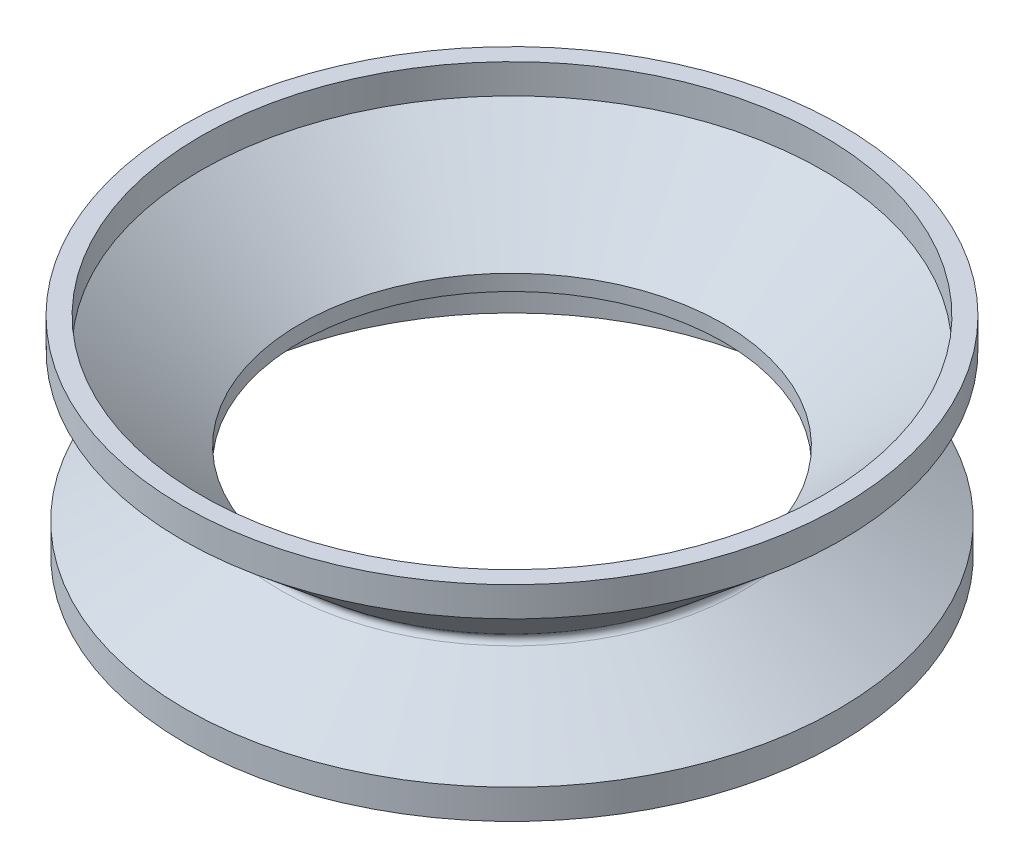
ISO-10303-21;
HEADER;
FILE_DESCRIPTION(('STEP AP214'),'2;1');
FILE_NAME('part.step','',(''),(''),'','','');
FILE_SCHEMA(('AUTOMOTIVE_DESIGN { 1 0 10303 214 1 1 1 1 }'));
ENDSEC;
DATA;
#1=APPLICATION_CONTEXT('core data for automotive mechanical design processes');
#2=APPLICATION_PROTOCOL_DEFINITION('international standard','automotive_design',2000,#1);
#3=PRODUCT_CONTEXT('',#1,'mechanical');
#4=PRODUCT('Part','Part','',(#3));
#5=PRODUCT_RELATED_PRODUCT_CATEGORY('part','',(#4));
#6=PRODUCT_DEFINITION_FORMATION('','',#4);
#7=PRODUCT_DEFINITION_CONTEXT('part definition',#1,'design');
#8=PRODUCT_DEFINITION('design','',#6,#7);
#9=PRODUCT_DEFINITION_SHAPE('','',#8);
#10=(LENGTH_UNIT() NAMED_UNIT(*) SI_UNIT(.MILLI.,.METRE.));
#11=(NAMED_UNIT(*) PLANE_ANGLE_UNIT() SI_UNIT($,.RADIAN.));
#12=(NAMED_UNIT(*) SI_UNIT($,.STERADIAN.) SOLID_ANGLE_UNIT());
#13=UNCERTAINTY_MEASURE_WITH_UNIT(LENGTH_MEASURE(1.E-05),#10,'distance_accuracy_value','');
#14=(GEOMETRIC_REPRESENTATION_CONTEXT(3) GLOBAL_UNCERTAINTY_ASSIGNED_CONTEXT((#13)) GLOBAL_UNIT_ASSIGNED_CONTEXT((#10,
#11,#12)) REPRESENTATION_CONTEXT('',''));
#15=CARTESIAN_POINT('',(0.,0.,0.));
#16=DIRECTION('',(0.,0.,1.));
#17=DIRECTION('',(1.,0.,0.));
#18=AXIS2_PLACEMENT_3D('',#15,#16,#17);
#19=CARTESIAN_POINT('',(15.756839458557,0.,0.));
#20=DIRECTION('',(0.,-1.,0.));
#21=DIRECTION('',(0.,0.,-1.));
#22=AXIS2_PLACEMENT_3D('',#19,#20,#21);
#23=CONICAL_SURFACE('',#22,15.094057505923,1.0471975511966);
#24=CARTESIAN_POINT('',(15.756839458557,-0.285629601348422,0.));
#25=DIRECTION('',(0.,-1.,0.));
#26=DIRECTION('',(0.,0.,-1.));
#27=AXIS2_PLACEMENT_3D('',#24,#25,#26);
#28=CIRCLE('',#27,15.5887824876041);
#29=CARTESIAN_POINT('',(15.756839458557,-0.285629601348422,-15.5887824876041));
#30=VERTEX_POINT('',#29);
#31=EDGE_CURVE('E10',#30,#30,#28,.T.);
#32=ORIENTED_EDGE('',*,*,#31,.T.);
#33=EDGE_LOOP('',(#32));
#34=FACE_BOUND('',#33,.T.);
#35=CARTESIAN_POINT('',(15.756839458557,-4.,0.));
#36=DIRECTION('',(0.,-1.,0.));
#37=DIRECTION('',(1.,0.,0.));
#38=AXIS2_PLACEMENT_3D('',#35,#36,#37);
#39=CIRCLE('',#38,22.0222607361986);
#40=CARTESIAN_POINT('',(37.7791001947556,-4.,0.));
#41=VERTEX_POINT('',#40);
#42=EDGE_CURVE('E88',#41,#41,#39,.T.);
#43=ORIENTED_EDGE('',*,*,#42,.F.);
#44=EDGE_LOOP('',(#43));
#45=FACE_BOUND('',#44,.T.);
#46=ADVANCED_FACE('F43',(#34,#45),#23,.T.);
#47=CARTESIAN_POINT('',(15.756839458557,6.,0.));
#48=DIRECTION('',(0.,1.,0.));
#49=DIRECTION('',(0.,0.,1.));
#50=AXIS2_PLACEMENT_3D('',#47,#48,#49);
#51=CONICAL_SURFACE('',#50,22.2445790614883,0.872664625997171);
#52=CARTESIAN_POINT('',(15.756839458557,0.367198337412951,0.));
#53=DIRECTION('',(0.,1.,0.));
#54=DIRECTION('',(0.,0.,1.));
#55=AXIS2_PLACEMENT_3D('',#52,#53,#54);
#56=CIRCLE('',#55,15.5316674437295);
#57=CARTESIAN_POINT('',(15.756839458557,0.367198337412951,15.5316674437295));
#58=VERTEX_POINT('',#57);
#59=EDGE_CURVE('E51',#58,#58,#56,.T.);
#60=ORIENTED_EDGE('',*,*,#59,.T.);
#61=EDGE_LOOP('',(#60));
#62=FACE_BOUND('',#61,.T.);
#63=CARTESIAN_POINT('',(15.756839458557,6.,0.));
#64=DIRECTION('',(0.,1.,0.));
#65=DIRECTION('',(0.,0.,1.));
#66=AXIS2_PLACEMENT_3D('',#63,#64,#65);
#67=CIRCLE('',#66,22.2445790614883);
#68=CARTESIAN_POINT('',(15.756839458557,6.,22.2445790614883));
#69=VERTEX_POINT('',#68);
#70=EDGE_CURVE('E56',#69,#69,#67,.T.);
#71=ORIENTED_EDGE('',*,*,#70,.F.);
#72=EDGE_LOOP('',(#71));
#73=FACE_BOUND('',#72,.T.);
#74=ADVANCED_FACE('F120',(#62,#73),#51,.T.);
#75=CARTESIAN_POINT('',(15.756839458557,0.373046126524002,0.));
#76=DIRECTION('',(0.,1.,0.));
#77=DIRECTION('',(0.,0.,1.));
#78=AXIS2_PLACEMENT_3D('',#75,#76,#77);
#79=CONICAL_SURFACE('',#78,14.294057505923,0.872664625997171);
#80=CARTESIAN_POINT('',(15.756839458557,6.,0.));
#81=DIRECTION('',(0.,1.,0.));
#82=DIRECTION('',(-1.,0.,0.));
#83=AXIS2_PLACEMENT_3D('',#80,#81,#82);
#84=CIRCLE('',#83,21.);
#85=CARTESIAN_POINT('',(-5.24316054144304,6.,0.));
#86=VERTEX_POINT('',#85);
#87=EDGE_CURVE('E80',#86,#86,#84,.T.);
#88=ORIENTED_EDGE('',*,*,#87,.T.);
#89=EDGE_LOOP('',(#88));
#90=FACE_BOUND('',#89,.T.);
#91=CARTESIAN_POINT('',(15.756839458557,0.373046126524002,0.));
#92=DIRECTION('',(0.,1.,0.));
#93=DIRECTION('',(0.,0.,1.));
#94=AXIS2_PLACEMENT_3D('',#91,#92,#93);
#95=CIRCLE('',#94,14.294057505923);
#96=CARTESIAN_POINT('',(15.756839458557,0.373046126524002,14.294057505923));
#97=VERTEX_POINT('',#96);
#98=EDGE_CURVE('E61',#97,#97,#95,.T.);
#99=ORIENTED_EDGE('',*,*,#98,.F.);
#100=EDGE_LOOP('',(#99));
#101=FACE_BOUND('',#100,.T.);
#102=ADVANCED_FACE('F125',(#90,#101),#79,.F.);
#103=CARTESIAN_POINT('',(15.756839458557,5.60901803281973,0.));
#104=DIRECTION('',(0.,1.,0.));
#105=DIRECTION('',(0.,0.,1.));
#106=AXIS2_PLACEMENT_3D('',#103,#104,#105);
#107=CYLINDRICAL_SURFACE('',#106,14.294057505923);
#108=ORIENTED_EDGE('',*,*,#98,.T.);
#109=EDGE_LOOP('',(#108));
#110=FACE_BOUND('',#109,.T.);
#111=CARTESIAN_POINT('',(15.756839458557,-0.692820323027554,0.));
#112=DIRECTION('',(0.,1.,0.));
#113=DIRECTION('',(0.,0.,1.));
#114=AXIS2_PLACEMENT_3D('',#111,#112,#113);
#115=CIRCLE('',#114,14.294057505923);
#116=CARTESIAN_POINT('',(15.756839458557,-0.692820323027554,14.294057505923));
#117=VERTEX_POINT('',#116);
#118=EDGE_CURVE('E67',#117,#117,#115,.T.);
#119=ORIENTED_EDGE('',*,*,#118,.F.);
#120=EDGE_LOOP('',(#119));
#121=FACE_BOUND('',#120,.T.);
#122=ADVANCED_FACE('F131',(#110,#121),#107,.F.);
#123=CARTESIAN_POINT('',(15.756839458557,-4.,0.));
#124=DIRECTION('',(0.,-1.,0.));
#125=DIRECTION('',(0.,0.,-1.));
#126=AXIS2_PLACEMENT_3D('',#123,#124,#125);
#127=CONICAL_SURFACE('',#126,20.0222607361986,1.0471975511966);
#128=ORIENTED_EDGE('',*,*,#118,.T.);
#129=EDGE_LOOP('',(#128));
#130=FACE_BOUND('',#129,.T.);
#131=CARTESIAN_POINT('',(15.756839458557,-4.,0.));
#132=DIRECTION('',(0.,1.,0.));
#133=DIRECTION('',(0.,0.,1.));
#134=AXIS2_PLACEMENT_3D('',#131,#132,#133);
#135=CIRCLE('',#134,20.0222607361986);
#136=CARTESIAN_POINT('',(15.756839458557,-4.,20.0222607361986));
#137=VERTEX_POINT('',#136);
#138=EDGE_CURVE('E71',#137,#137,#135,.T.);
#139=ORIENTED_EDGE('',*,*,#138,.F.);
#140=EDGE_LOOP('',(#139));
#141=FACE_BOUND('',#140,.T.);
#142=ADVANCED_FACE('F135',(#130,#141),#127,.F.);
#143=CARTESIAN_POINT('',(15.756839458557,0.0607805601653536,0.));
#144=DIRECTION('',(0.,1.,0.));
#145=DIRECTION('',(0.,0.,1.));
#146=AXIS2_PLACEMENT_3D('',#143,#144,#145);
#147=TOROIDAL_SURFACE('',#146,15.7887824876041,0.4);
#148=ORIENTED_EDGE('',*,*,#31,.F.);
#149=EDGE_LOOP('',(#148));
#150=FACE_BOUND('',#149,.T.);
#151=ORIENTED_EDGE('',*,*,#59,.F.);
#152=EDGE_LOOP('',(#151));
#153=FACE_BOUND('',#152,.T.);
#154=ADVANCED_FACE('F45',(#150,#153),#147,.F.);
#155=CARTESIAN_POINT('',(15.756839458557,8.,0.));
#156=DIRECTION('',(0.,1.,0.));
#157=DIRECTION('',(-1.,0.,0.));
#158=AXIS2_PLACEMENT_3D('',#155,#156,#157);
#159=PLANE('',#158);
#160=CARTESIAN_POINT('',(15.756839458557,8.,0.));
#161=DIRECTION('',(0.,1.,0.));
#162=DIRECTION('',(-1.,0.,0.));
#163=AXIS2_PLACEMENT_3D('',#160,#161,#162);
#164=CIRCLE('',#163,22.2445790614883);
#165=CARTESIAN_POINT('',(-6.48773960293139,8.,0.));
#166=VERTEX_POINT('',#165);
#167=EDGE_CURVE('E75',#166,#166,#164,.T.);
#168=ORIENTED_EDGE('',*,*,#167,.T.);
#169=EDGE_LOOP('',(#168));
#170=FACE_BOUND('',#169,.T.);
#171=CARTESIAN_POINT('',(15.756839458557,8.,0.));
#172=DIRECTION('',(0.,1.,0.));
#173=DIRECTION('',(-1.,0.,0.));
#174=AXIS2_PLACEMENT_3D('',#171,#172,#173);
#175=CIRCLE('',#174,21.);
#176=CARTESIAN_POINT('',(-5.24316054144304,8.,0.));
#177=VERTEX_POINT('',#176);
#178=EDGE_CURVE('E79',#177,#177,#175,.T.);
#179=ORIENTED_EDGE('',*,*,#178,.F.);
#180=EDGE_LOOP('',(#179));
#181=FACE_BOUND('',#180,.T.);
#182=ADVANCED_FACE('F141',(#170,#181),#159,.T.);
#183=CARTESIAN_POINT('',(15.756839458557,8.,0.));
#184=DIRECTION('',(0.,-1.,0.));
#185=DIRECTION('',(1.,0.,0.));
#186=AXIS2_PLACEMENT_3D('',#183,#184,#185);
#187=CYLINDRICAL_SURFACE('',#186,22.2445790614883);
#188=ORIENTED_EDGE('',*,*,#167,.F.);
#189=EDGE_LOOP('',(#188));
#190=FACE_BOUND('',#189,.T.);
#191=ORIENTED_EDGE('',*,*,#70,.T.);
#192=EDGE_LOOP('',(#191));
#193=FACE_BOUND('',#192,.T.);
#194=ADVANCED_FACE('F115',(#190,#193),#187,.T.);
#195=CARTESIAN_POINT('',(15.756839458557,8.,0.));
#196=DIRECTION('',(0.,-1.,0.));
#197=DIRECTION('',(1.,0.,0.));
#198=AXIS2_PLACEMENT_3D('',#195,#196,#197);
#199=CYLINDRICAL_SURFACE('',#198,21.);
#200=ORIENTED_EDGE('',*,*,#178,.T.);
#201=EDGE_LOOP('',(#200));
#202=FACE_BOUND('',#201,.T.);
#203=ORIENTED_EDGE('',*,*,#87,.F.);
#204=EDGE_LOOP('',(#203));
#205=FACE_BOUND('',#204,.T.);
#206=ADVANCED_FACE('F106',(#202,#205),#199,.F.);
#207=CARTESIAN_POINT('',(15.756839458557,-5.99999999999999,0.));
#208=DIRECTION('',(0.,-1.,0.));
#209=DIRECTION('',(1.,0.,0.));
#210=AXIS2_PLACEMENT_3D('',#207,#208,#209);
#211=PLANE('',#210);
#212=CARTESIAN_POINT('',(15.756839458557,-5.99999999999999,0.));
#213=DIRECTION('',(0.,-1.,0.));
#214=DIRECTION('',(1.,0.,0.));
#215=AXIS2_PLACEMENT_3D('',#212,#213,#214);
#216=CIRCLE('',#215,22.0222607361986);
#217=CARTESIAN_POINT('',(37.7791001947556,-5.99999999999999,0.));
#218=VERTEX_POINT('',#217);
#219=EDGE_CURVE('E84',#218,#218,#216,.T.);
#220=ORIENTED_EDGE('',*,*,#219,.T.);
#221=EDGE_LOOP('',(#220));
#222=FACE_BOUND('',#221,.T.);
#223=CARTESIAN_POINT('',(15.756839458557,-5.99999999999999,0.));
#224=DIRECTION('',(0.,-1.,0.));
#225=DIRECTION('',(1.,0.,0.));
#226=AXIS2_PLACEMENT_3D('',#223,#224,#225);
#227=CIRCLE('',#226,20.0222607361986);
#228=CARTESIAN_POINT('',(35.7791001947555,-5.99999999999999,0.));
#229=VERTEX_POINT('',#228);
#230=EDGE_CURVE('E92',#229,#229,#227,.T.);
#231=ORIENTED_EDGE('',*,*,#230,.F.);
#232=EDGE_LOOP('',(#231));
#233=FACE_BOUND('',#232,.T.);
#234=ADVANCED_FACE('F103',(#222,#233),#211,.T.);
#235=CARTESIAN_POINT('',(15.756839458557,-5.99999999999999,0.));
#236=DIRECTION('',(0.,1.,0.));
#237=DIRECTION('',(-1.,0.,0.));
#238=AXIS2_PLACEMENT_3D('',#235,#236,#237);
#239=CYLINDRICAL_SURFACE('',#238,22.0222607361986);
#240=ORIENTED_EDGE('',*,*,#219,.F.);
#241=EDGE_LOOP('',(#240));
#242=FACE_BOUND('',#241,.T.);
#243=ORIENTED_EDGE('',*,*,#42,.T.);
#244=EDGE_LOOP('',(#243));
#245=FACE_BOUND('',#244,.T.);
#246=ADVANCED_FACE('F105',(#242,#245),#239,.T.);
#247=CARTESIAN_POINT('',(15.756839458557,-5.99999999999999,0.));
#248=DIRECTION('',(0.,1.,0.));
#249=DIRECTION('',(-1.,0.,0.));
#250=AXIS2_PLACEMENT_3D('',#247,#248,#249);
#251=CYLINDRICAL_SURFACE('',#250,20.0222607361986);
#252=ORIENTED_EDGE('',*,*,#230,.T.);
#253=EDGE_LOOP('',(#252));
#254=FACE_BOUND('',#253,.T.);
#255=ORIENTED_EDGE('',*,*,#138,.T.);
#256=EDGE_LOOP('',(#255));
#257=FACE_BOUND('',#256,.T.);
#258=ADVANCED_FACE('F100',(#254,#257),#251,.F.);
#259=CLOSED_SHELL('',(#46,#74,#102,#122,#142,#154,#182,#194,#206,#234,#246,#258));
#260=MANIFOLD_SOLID_BREP('B2',#259);
#261=ADVANCED_BREP_SHAPE_REPRESENTATION('',(#18,#260),#14);
#262=SHAPE_DEFINITION_REPRESENTATION(#9,#261);
ENDSEC;
END-ISO-10303-21;
